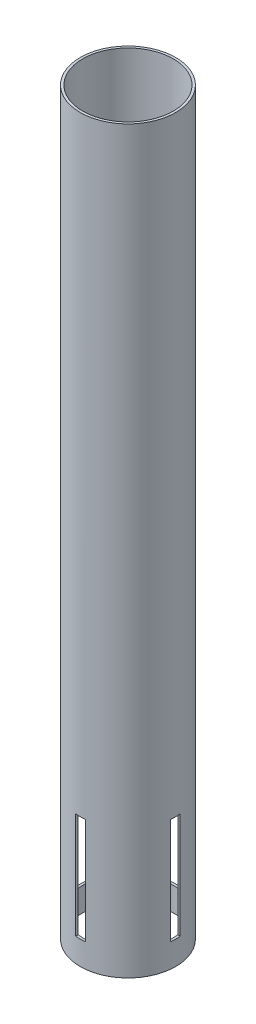
ISO-10303-21;
HEADER;
FILE_DESCRIPTION(('STEP AP214'),'2;1');
FILE_NAME('part.step','',(''),(''),'','','');
FILE_SCHEMA(('AUTOMOTIVE_DESIGN { 1 0 10303 214 1 1 1 1 }'));
ENDSEC;
DATA;
#1=APPLICATION_CONTEXT('core data for automotive mechanical design processes');
#2=APPLICATION_PROTOCOL_DEFINITION('international standard','automotive_design',2000,#1);
#3=PRODUCT_CONTEXT('',#1,'mechanical');
#4=PRODUCT('Part','Part','',(#3));
#5=PRODUCT_RELATED_PRODUCT_CATEGORY('part','',(#4));
#6=PRODUCT_DEFINITION_FORMATION('','',#4);
#7=PRODUCT_DEFINITION_CONTEXT('part definition',#1,'design');
#8=PRODUCT_DEFINITION('design','',#6,#7);
#9=PRODUCT_DEFINITION_SHAPE('','',#8);
#10=(LENGTH_UNIT() NAMED_UNIT(*) SI_UNIT(.MILLI.,.METRE.));
#11=(NAMED_UNIT(*) PLANE_ANGLE_UNIT() SI_UNIT($,.RADIAN.));
#12=(NAMED_UNIT(*) SI_UNIT($,.STERADIAN.) SOLID_ANGLE_UNIT());
#13=UNCERTAINTY_MEASURE_WITH_UNIT(LENGTH_MEASURE(1.E-05),#10,'distance_accuracy_value','');
#14=(GEOMETRIC_REPRESENTATION_CONTEXT(3) GLOBAL_UNCERTAINTY_ASSIGNED_CONTEXT((#13)) GLOBAL_UNIT_ASSIGNED_CONTEXT((#10,
#11,#12)) REPRESENTATION_CONTEXT('',''));
#15=CARTESIAN_POINT('',(0.,0.,0.));
#16=DIRECTION('',(0.,0.,1.));
#17=DIRECTION('',(1.,0.,0.));
#18=AXIS2_PLACEMENT_3D('',#15,#16,#17);
#19=CARTESIAN_POINT('',(0.,787.4,0.));
#20=DIRECTION('',(0.,1.,0.));
#21=DIRECTION('',(0.,0.,1.));
#22=AXIS2_PLACEMENT_3D('',#19,#20,#21);
#23=PLANE('',#22);
#24=CARTESIAN_POINT('',(0.,787.4,0.));
#25=DIRECTION('',(0.,1.,0.));
#26=DIRECTION('',(0.,0.,1.));
#27=AXIS2_PLACEMENT_3D('',#24,#25,#26);
#28=CIRCLE('',#27,50.8);
#29=CARTESIAN_POINT('',(0.,787.4,50.8));
#30=VERTEX_POINT('',#29);
#31=EDGE_CURVE('E296',#30,#30,#28,.T.);
#32=ORIENTED_EDGE('',*,*,#31,.T.);
#33=EDGE_LOOP('',(#32));
#34=FACE_BOUND('',#33,.T.);
#35=CARTESIAN_POINT('',(0.,787.4,0.));
#36=DIRECTION('',(0.,1.,0.));
#37=DIRECTION('',(0.,0.,1.));
#38=AXIS2_PLACEMENT_3D('',#35,#36,#37);
#39=CIRCLE('',#38,48.26);
#40=CARTESIAN_POINT('',(0.,787.4,48.26));
#41=VERTEX_POINT('',#40);
#42=EDGE_CURVE('E288',#41,#41,#39,.T.);
#43=ORIENTED_EDGE('',*,*,#42,.F.);
#44=EDGE_LOOP('',(#43));
#45=FACE_BOUND('',#44,.T.);
#46=ADVANCED_FACE('F38',(#34,#45),#23,.T.);
#47=CARTESIAN_POINT('',(0.,0.,0.));
#48=DIRECTION('',(0.,1.,0.));
#49=DIRECTION('',(0.,0.,1.));
#50=AXIS2_PLACEMENT_3D('',#47,#48,#49);
#51=PLANE('',#50);
#52=CARTESIAN_POINT('',(0.,0.,0.));
#53=DIRECTION('',(0.,1.,0.));
#54=DIRECTION('',(0.,0.,1.));
#55=AXIS2_PLACEMENT_3D('',#52,#53,#54);
#56=CIRCLE('',#55,50.8);
#57=CARTESIAN_POINT('',(0.,0.,50.8));
#58=VERTEX_POINT('',#57);
#59=EDGE_CURVE('E292',#58,#58,#56,.T.);
#60=ORIENTED_EDGE('',*,*,#59,.F.);
#61=EDGE_LOOP('',(#60));
#62=FACE_BOUND('',#61,.T.);
#63=CARTESIAN_POINT('',(0.,0.,0.));
#64=DIRECTION('',(0.,1.,0.));
#65=DIRECTION('',(0.,0.,1.));
#66=AXIS2_PLACEMENT_3D('',#63,#64,#65);
#67=CIRCLE('',#66,48.26);
#68=CARTESIAN_POINT('',(0.,0.,48.26));
#69=VERTEX_POINT('',#68);
#70=EDGE_CURVE('E287',#69,#69,#67,.T.);
#71=ORIENTED_EDGE('',*,*,#70,.T.);
#72=EDGE_LOOP('',(#71));
#73=FACE_BOUND('',#72,.T.);
#74=ADVANCED_FACE('F356',(#62,#73),#51,.F.);
#75=CARTESIAN_POINT('',(0.,787.4,0.));
#76=DIRECTION('',(0.,-1.,0.));
#77=DIRECTION('',(0.,0.,-1.));
#78=AXIS2_PLACEMENT_3D('',#75,#76,#77);
#79=CYLINDRICAL_SURFACE('',#78,50.8);
#80=DIRECTION('',(0.,-1.,0.));
#81=VECTOR('',#80,1.);
#82=CARTESIAN_POINT('',(-50.5453618050163,787.4,5.07999999999989));
#83=LINE('',#82,#81);
#84=CARTESIAN_POINT('',(-50.5453618050163,138.176,5.07999999999997));
#85=VERTEX_POINT('',#84);
#86=CARTESIAN_POINT('',(-50.5453618050163,25.4,5.07999999999999));
#87=VERTEX_POINT('',#86);
#88=EDGE_CURVE('E240',#85,#87,#83,.T.);
#89=ORIENTED_EDGE('',*,*,#88,.T.);
#90=CARTESIAN_POINT('',(0.,25.4,0.));
#91=DIRECTION('',(0.,-1.,0.));
#92=DIRECTION('',(0.,0.,-1.));
#93=AXIS2_PLACEMENT_3D('',#90,#91,#92);
#94=CIRCLE('',#93,50.8);
#95=CARTESIAN_POINT('',(-50.5453618050163,25.4,-5.07999999999999));
#96=VERTEX_POINT('',#95);
#97=EDGE_CURVE('E54',#87,#96,#94,.T.);
#98=ORIENTED_EDGE('',*,*,#97,.T.);
#99=DIRECTION('',(0.,-1.,0.));
#100=VECTOR('',#99,1.);
#101=CARTESIAN_POINT('',(-50.5453618050163,787.4,-5.08000000000028));
#102=LINE('',#101,#100);
#103=CARTESIAN_POINT('',(-50.5453618050163,138.176,-5.08000000000003));
#104=VERTEX_POINT('',#103);
#105=EDGE_CURVE('E172',#96,#104,#102,.F.);
#106=ORIENTED_EDGE('',*,*,#105,.T.);
#107=CARTESIAN_POINT('',(0.,138.176,0.));
#108=DIRECTION('',(0.,1.,0.));
#109=DIRECTION('',(0.,0.,1.));
#110=AXIS2_PLACEMENT_3D('',#107,#108,#109);
#111=CIRCLE('',#110,50.8);
#112=EDGE_CURVE('E234',#104,#85,#111,.T.);
#113=ORIENTED_EDGE('',*,*,#112,.T.);
#114=EDGE_LOOP('',(#89,#98,#106,#113));
#115=FACE_BOUND('',#114,.T.);
#116=DIRECTION('',(0.,-1.,0.));
#117=VECTOR('',#116,1.);
#118=CARTESIAN_POINT('',(50.5453618050163,787.4,-5.08000000000028));
#119=LINE('',#118,#117);
#120=CARTESIAN_POINT('',(50.5453618050163,138.176,-5.08000000000003));
#121=VERTEX_POINT('',#120);
#122=CARTESIAN_POINT('',(50.5453618050163,25.4,-5.07999999999999));
#123=VERTEX_POINT('',#122);
#124=EDGE_CURVE('E220',#121,#123,#119,.T.);
#125=ORIENTED_EDGE('',*,*,#124,.T.);
#126=CARTESIAN_POINT('',(50.5453618050163,25.4,5.07999999999999));
#127=VERTEX_POINT('',#126);
#128=EDGE_CURVE('E62',#123,#127,#94,.T.);
#129=ORIENTED_EDGE('',*,*,#128,.T.);
#130=DIRECTION('',(0.,-1.,0.));
#131=VECTOR('',#130,1.);
#132=CARTESIAN_POINT('',(50.5453618050163,787.4,5.07999999999989));
#133=LINE('',#132,#131);
#134=CARTESIAN_POINT('',(50.5453618050163,138.176,5.07999999999997));
#135=VERTEX_POINT('',#134);
#136=EDGE_CURVE('E210',#127,#135,#133,.F.);
#137=ORIENTED_EDGE('',*,*,#136,.T.);
#138=EDGE_CURVE('E235',#135,#121,#111,.T.);
#139=ORIENTED_EDGE('',*,*,#138,.T.);
#140=EDGE_LOOP('',(#125,#129,#137,#139));
#141=FACE_BOUND('',#140,.T.);
#142=DIRECTION('',(0.,-1.,0.));
#143=VECTOR('',#142,1.);
#144=CARTESIAN_POINT('',(5.08000000000003,787.4,-50.5453618050163));
#145=LINE('',#144,#143);
#146=CARTESIAN_POINT('',(5.08,25.4,-50.5453618050163));
#147=VERTEX_POINT('',#146);
#148=CARTESIAN_POINT('',(5.08,138.176,-50.5453618050163));
#149=VERTEX_POINT('',#148);
#150=EDGE_CURVE('E267',#147,#149,#145,.F.);
#151=ORIENTED_EDGE('',*,*,#150,.T.);
#152=CARTESIAN_POINT('',(0.,138.176,0.));
#153=DIRECTION('',(0.,1.,0.));
#154=DIRECTION('',(0.,0.,1.));
#155=AXIS2_PLACEMENT_3D('',#152,#153,#154);
#156=CIRCLE('',#155,50.8);
#157=CARTESIAN_POINT('',(-5.08,138.176,-50.5453618050163));
#158=VERTEX_POINT('',#157);
#159=EDGE_CURVE('E278',#149,#158,#156,.T.);
#160=ORIENTED_EDGE('',*,*,#159,.T.);
#161=DIRECTION('',(0.,-1.,0.));
#162=VECTOR('',#161,1.);
#163=CARTESIAN_POINT('',(-5.08,787.4,-50.5453618050163));
#164=LINE('',#163,#162);
#165=CARTESIAN_POINT('',(-5.08,25.4,-50.5453618050163));
#166=VERTEX_POINT('',#165);
#167=EDGE_CURVE('E283',#158,#166,#164,.T.);
#168=ORIENTED_EDGE('',*,*,#167,.T.);
#169=CARTESIAN_POINT('',(0.,25.4,0.));
#170=DIRECTION('',(0.,-1.,0.));
#171=DIRECTION('',(0.,0.,-1.));
#172=AXIS2_PLACEMENT_3D('',#169,#170,#171);
#173=CIRCLE('',#172,50.8);
#174=EDGE_CURVE('E263',#166,#147,#173,.T.);
#175=ORIENTED_EDGE('',*,*,#174,.T.);
#176=EDGE_LOOP('',(#151,#160,#168,#175));
#177=FACE_BOUND('',#176,.T.);
#178=CARTESIAN_POINT('',(-5.08,138.176,50.5453618050163));
#179=VERTEX_POINT('',#178);
#180=CARTESIAN_POINT('',(5.08,138.176,50.5453618050163));
#181=VERTEX_POINT('',#180);
#182=EDGE_CURVE('E275',#179,#181,#156,.T.);
#183=ORIENTED_EDGE('',*,*,#182,.T.);
#184=DIRECTION('',(0.,-1.,0.));
#185=VECTOR('',#184,1.);
#186=CARTESIAN_POINT('',(5.08000000000003,787.4,50.5453618050163));
#187=LINE('',#186,#185);
#188=CARTESIAN_POINT('',(5.08,25.4,50.5453618050163));
#189=VERTEX_POINT('',#188);
#190=EDGE_CURVE('E271',#181,#189,#187,.T.);
#191=ORIENTED_EDGE('',*,*,#190,.T.);
#192=CARTESIAN_POINT('',(-5.08,25.4,50.5453618050163));
#193=VERTEX_POINT('',#192);
#194=EDGE_CURVE('E266',#189,#193,#173,.T.);
#195=ORIENTED_EDGE('',*,*,#194,.T.);
#196=DIRECTION('',(0.,-1.,0.));
#197=VECTOR('',#196,1.);
#198=CARTESIAN_POINT('',(-5.08,787.4,50.5453618050163));
#199=LINE('',#198,#197);
#200=EDGE_CURVE('E279',#193,#179,#199,.F.);
#201=ORIENTED_EDGE('',*,*,#200,.T.);
#202=EDGE_LOOP('',(#183,#191,#195,#201));
#203=FACE_BOUND('',#202,.T.);
#204=ORIENTED_EDGE('',*,*,#31,.F.);
#205=EDGE_LOOP('',(#204));
#206=FACE_BOUND('',#205,.T.);
#207=ORIENTED_EDGE('',*,*,#59,.T.);
#208=EDGE_LOOP('',(#207));
#209=FACE_BOUND('',#208,.T.);
#210=ADVANCED_FACE('F40',(#115,#141,#177,#203,#206,#209),#79,.T.);
#211=CARTESIAN_POINT('',(0.,787.4,0.));
#212=DIRECTION('',(0.,-1.,0.));
#213=DIRECTION('',(0.,0.,-1.));
#214=AXIS2_PLACEMENT_3D('',#211,#212,#213);
#215=CYLINDRICAL_SURFACE('',#214,48.26);
#216=DIRECTION('',(0.,-1.,0.));
#217=VECTOR('',#216,1.);
#218=CARTESIAN_POINT('',(47.9918868143356,787.4,5.07999999999989));
#219=LINE('',#218,#217);
#220=CARTESIAN_POINT('',(47.9918868143356,25.4,5.07999999999999));
#221=VERTEX_POINT('',#220);
#222=CARTESIAN_POINT('',(47.9918868143356,138.176,5.07999999999997));
#223=VERTEX_POINT('',#222);
#224=EDGE_CURVE('E11',#221,#223,#219,.F.);
#225=ORIENTED_EDGE('',*,*,#224,.F.);
#226=CARTESIAN_POINT('',(0.,25.4,0.));
#227=DIRECTION('',(0.,-1.,0.));
#228=DIRECTION('',(0.,0.,-1.));
#229=AXIS2_PLACEMENT_3D('',#226,#227,#228);
#230=CIRCLE('',#229,48.26);
#231=CARTESIAN_POINT('',(47.9918868143356,25.4,-5.07999999999999));
#232=VERTEX_POINT('',#231);
#233=EDGE_CURVE('E167',#232,#221,#230,.T.);
#234=ORIENTED_EDGE('',*,*,#233,.F.);
#235=DIRECTION('',(0.,-1.,0.));
#236=VECTOR('',#235,1.);
#237=CARTESIAN_POINT('',(47.9918868143356,787.4,-5.08000000000028));
#238=LINE('',#237,#236);
#239=CARTESIAN_POINT('',(47.9918868143356,138.176,-5.08000000000003));
#240=VERTEX_POINT('',#239);
#241=EDGE_CURVE('E189',#240,#232,#238,.T.);
#242=ORIENTED_EDGE('',*,*,#241,.F.);
#243=CARTESIAN_POINT('',(0.,138.176,0.));
#244=DIRECTION('',(0.,1.,0.));
#245=DIRECTION('',(0.,0.,1.));
#246=AXIS2_PLACEMENT_3D('',#243,#244,#245);
#247=CIRCLE('',#246,48.26);
#248=EDGE_CURVE('E47',#223,#240,#247,.T.);
#249=ORIENTED_EDGE('',*,*,#248,.F.);
#250=EDGE_LOOP('',(#225,#234,#242,#249));
#251=FACE_BOUND('',#250,.T.);
#252=DIRECTION('',(0.,-1.,0.));
#253=VECTOR('',#252,1.);
#254=CARTESIAN_POINT('',(-47.9918868143356,787.4,5.07999999999989));
#255=LINE('',#254,#253);
#256=CARTESIAN_POINT('',(-47.9918868143356,138.176,5.07999999999997));
#257=VERTEX_POINT('',#256);
#258=CARTESIAN_POINT('',(-47.9918868143356,25.4,5.07999999999999));
#259=VERTEX_POINT('',#258);
#260=EDGE_CURVE('E184',#257,#259,#255,.T.);
#261=ORIENTED_EDGE('',*,*,#260,.F.);
#262=CARTESIAN_POINT('',(-47.9918868143356,138.176,-5.08000000000003));
#263=VERTEX_POINT('',#262);
#264=EDGE_CURVE('E180',#263,#257,#247,.T.);
#265=ORIENTED_EDGE('',*,*,#264,.F.);
#266=DIRECTION('',(0.,-1.,0.));
#267=VECTOR('',#266,1.);
#268=CARTESIAN_POINT('',(-47.9918868143356,787.4,-5.08000000000028));
#269=LINE('',#268,#267);
#270=CARTESIAN_POINT('',(-47.9918868143356,25.4,-5.07999999999999));
#271=VERTEX_POINT('',#270);
#272=EDGE_CURVE('E164',#271,#263,#269,.F.);
#273=ORIENTED_EDGE('',*,*,#272,.F.);
#274=EDGE_CURVE('E152',#259,#271,#230,.T.);
#275=ORIENTED_EDGE('',*,*,#274,.F.);
#276=EDGE_LOOP('',(#261,#265,#273,#275));
#277=FACE_BOUND('',#276,.T.);
#278=DIRECTION('',(0.,-1.,0.));
#279=VECTOR('',#278,1.);
#280=CARTESIAN_POINT('',(-5.08,787.4,47.9918868143356));
#281=LINE('',#280,#279);
#282=CARTESIAN_POINT('',(-5.08,25.4,47.9918868143356));
#283=VERTEX_POINT('',#282);
#284=CARTESIAN_POINT('',(-5.08,138.176,47.9918868143356));
#285=VERTEX_POINT('',#284);
#286=EDGE_CURVE('E165',#283,#285,#281,.F.);
#287=ORIENTED_EDGE('',*,*,#286,.F.);
#288=CARTESIAN_POINT('',(0.,25.4,0.));
#289=DIRECTION('',(0.,-1.,0.));
#290=DIRECTION('',(0.,0.,-1.));
#291=AXIS2_PLACEMENT_3D('',#288,#289,#290);
#292=CIRCLE('',#291,48.26);
#293=CARTESIAN_POINT('',(5.08,25.4,47.9918868143356));
#294=VERTEX_POINT('',#293);
#295=EDGE_CURVE('E307',#294,#283,#292,.T.);
#296=ORIENTED_EDGE('',*,*,#295,.F.);
#297=DIRECTION('',(0.,-1.,0.));
#298=VECTOR('',#297,1.);
#299=CARTESIAN_POINT('',(5.08000000000003,787.4,47.9918868143356));
#300=LINE('',#299,#298);
#301=CARTESIAN_POINT('',(5.08,138.176,47.9918868143356));
#302=VERTEX_POINT('',#301);
#303=EDGE_CURVE('E318',#302,#294,#300,.T.);
#304=ORIENTED_EDGE('',*,*,#303,.F.);
#305=CARTESIAN_POINT('',(0.,138.176,0.));
#306=DIRECTION('',(0.,1.,0.));
#307=DIRECTION('',(0.,0.,1.));
#308=AXIS2_PLACEMENT_3D('',#305,#306,#307);
#309=CIRCLE('',#308,48.26);
#310=EDGE_CURVE('E314',#285,#302,#309,.T.);
#311=ORIENTED_EDGE('',*,*,#310,.F.);
#312=EDGE_LOOP('',(#287,#296,#304,#311));
#313=FACE_BOUND('',#312,.T.);
#314=DIRECTION('',(0.,-1.,0.));
#315=VECTOR('',#314,1.);
#316=CARTESIAN_POINT('',(-5.08,787.4,-47.9918868143356));
#317=LINE('',#316,#315);
#318=CARTESIAN_POINT('',(-5.08,138.176,-47.9918868143356));
#319=VERTEX_POINT('',#318);
#320=CARTESIAN_POINT('',(-5.08,25.4,-47.9918868143356));
#321=VERTEX_POINT('',#320);
#322=EDGE_CURVE('E313',#319,#321,#317,.T.);
#323=ORIENTED_EDGE('',*,*,#322,.F.);
#324=CARTESIAN_POINT('',(5.08,138.176,-47.9918868143356));
#325=VERTEX_POINT('',#324);
#326=EDGE_CURVE('E310',#325,#319,#309,.T.);
#327=ORIENTED_EDGE('',*,*,#326,.F.);
#328=DIRECTION('',(0.,-1.,0.));
#329=VECTOR('',#328,1.);
#330=CARTESIAN_POINT('',(5.08000000000003,787.4,-47.9918868143356));
#331=LINE('',#330,#329);
#332=CARTESIAN_POINT('',(5.08,25.4,-47.9918868143356));
#333=VERTEX_POINT('',#332);
#334=EDGE_CURVE('E306',#333,#325,#331,.F.);
#335=ORIENTED_EDGE('',*,*,#334,.F.);
#336=EDGE_CURVE('E300',#321,#333,#292,.T.);
#337=ORIENTED_EDGE('',*,*,#336,.F.);
#338=EDGE_LOOP('',(#323,#327,#335,#337));
#339=FACE_BOUND('',#338,.T.);
#340=ORIENTED_EDGE('',*,*,#42,.T.);
#341=EDGE_LOOP('',(#340));
#342=FACE_BOUND('',#341,.T.);
#343=ORIENTED_EDGE('',*,*,#70,.F.);
#344=EDGE_LOOP('',(#343));
#345=FACE_BOUND('',#344,.T.);
#346=ADVANCED_FACE('F178',(#251,#277,#313,#339,#342,#345),#215,.F.);
#347=CARTESIAN_POINT('',(-5.08,25.4,-50.8));
#348=DIRECTION('',(0.,-1.,0.));
#349=DIRECTION('',(0.,0.,-1.));
#350=AXIS2_PLACEMENT_3D('',#347,#348,#349);
#351=PLANE('',#350);
#352=ORIENTED_EDGE('',*,*,#174,.F.);
#353=DIRECTION('',(0.,0.,1.));
#354=VECTOR('',#353,1.);
#355=CARTESIAN_POINT('',(-5.08,25.4,-50.8));
#356=LINE('',#355,#354);
#357=EDGE_CURVE('E259',#166,#321,#356,.T.);
#358=ORIENTED_EDGE('',*,*,#357,.T.);
#359=ORIENTED_EDGE('',*,*,#336,.T.);
#360=DIRECTION('',(0.,0.,1.));
#361=VECTOR('',#360,1.);
#362=CARTESIAN_POINT('',(5.08,25.4,-50.8));
#363=LINE('',#362,#361);
#364=EDGE_CURVE('E254',#147,#333,#363,.T.);
#365=ORIENTED_EDGE('',*,*,#364,.F.);
#366=EDGE_LOOP('',(#352,#358,#359,#365));
#367=FACE_BOUND('',#366,.T.);
#368=ADVANCED_FACE('F369',(#367),#351,.F.);
#369=CARTESIAN_POINT('',(5.08,25.4,-50.8));
#370=DIRECTION('',(1.,0.,0.));
#371=DIRECTION('',(0.,1.,0.));
#372=AXIS2_PLACEMENT_3D('',#369,#370,#371);
#373=PLANE('',#372);
#374=ORIENTED_EDGE('',*,*,#364,.T.);
#375=ORIENTED_EDGE('',*,*,#334,.T.);
#376=DIRECTION('',(0.,0.,1.));
#377=VECTOR('',#376,1.);
#378=CARTESIAN_POINT('',(5.08,138.176,-50.8));
#379=LINE('',#378,#377);
#380=EDGE_CURVE('E249',#149,#325,#379,.T.);
#381=ORIENTED_EDGE('',*,*,#380,.F.);
#382=ORIENTED_EDGE('',*,*,#150,.F.);
#383=EDGE_LOOP('',(#374,#375,#381,#382));
#384=FACE_BOUND('',#383,.T.);
#385=ADVANCED_FACE('F375',(#384),#373,.F.);
#386=CARTESIAN_POINT('',(-5.08,138.176,-50.8));
#387=DIRECTION('',(0.,1.,0.));
#388=DIRECTION('',(0.,0.,1.));
#389=AXIS2_PLACEMENT_3D('',#386,#387,#388);
#390=PLANE('',#389);
#391=ORIENTED_EDGE('',*,*,#380,.T.);
#392=ORIENTED_EDGE('',*,*,#326,.T.);
#393=DIRECTION('',(0.,0.,1.));
#394=VECTOR('',#393,1.);
#395=CARTESIAN_POINT('',(-5.08,138.176,-50.8));
#396=LINE('',#395,#394);
#397=EDGE_CURVE('E248',#158,#319,#396,.T.);
#398=ORIENTED_EDGE('',*,*,#397,.F.);
#399=ORIENTED_EDGE('',*,*,#159,.F.);
#400=EDGE_LOOP('',(#391,#392,#398,#399));
#401=FACE_BOUND('',#400,.T.);
#402=ADVANCED_FACE('F413',(#401),#390,.F.);
#403=CARTESIAN_POINT('',(-5.08,25.4,-50.8));
#404=DIRECTION('',(-1.,0.,0.));
#405=DIRECTION('',(0.,0.,1.));
#406=AXIS2_PLACEMENT_3D('',#403,#404,#405);
#407=PLANE('',#406);
#408=ORIENTED_EDGE('',*,*,#397,.T.);
#409=ORIENTED_EDGE('',*,*,#322,.T.);
#410=ORIENTED_EDGE('',*,*,#357,.F.);
#411=ORIENTED_EDGE('',*,*,#167,.F.);
#412=EDGE_LOOP('',(#408,#409,#410,#411));
#413=FACE_BOUND('',#412,.T.);
#414=ADVANCED_FACE('F421',(#413),#407,.F.);
#415=EDGE_CURVE('E243',#283,#193,#356,.T.);
#416=ORIENTED_EDGE('',*,*,#415,.F.);
#417=ORIENTED_EDGE('',*,*,#286,.T.);
#418=EDGE_CURVE('E244',#285,#179,#396,.T.);
#419=ORIENTED_EDGE('',*,*,#418,.T.);
#420=ORIENTED_EDGE('',*,*,#200,.F.);
#421=EDGE_LOOP('',(#416,#417,#419,#420));
#422=FACE_BOUND('',#421,.T.);
#423=ADVANCED_FACE('F429',(#422),#407,.F.);
#424=ORIENTED_EDGE('',*,*,#182,.F.);
#425=ORIENTED_EDGE('',*,*,#418,.F.);
#426=ORIENTED_EDGE('',*,*,#310,.T.);
#427=EDGE_CURVE('E250',#302,#181,#379,.T.);
#428=ORIENTED_EDGE('',*,*,#427,.T.);
#429=EDGE_LOOP('',(#424,#425,#426,#428));
#430=FACE_BOUND('',#429,.T.);
#431=ADVANCED_FACE('F330',(#430),#390,.F.);
#432=ORIENTED_EDGE('',*,*,#427,.F.);
#433=ORIENTED_EDGE('',*,*,#303,.T.);
#434=EDGE_CURVE('E255',#294,#189,#363,.T.);
#435=ORIENTED_EDGE('',*,*,#434,.T.);
#436=ORIENTED_EDGE('',*,*,#190,.F.);
#437=EDGE_LOOP('',(#432,#433,#435,#436));
#438=FACE_BOUND('',#437,.T.);
#439=ADVANCED_FACE('F334',(#438),#373,.F.);
#440=ORIENTED_EDGE('',*,*,#434,.F.);
#441=ORIENTED_EDGE('',*,*,#295,.T.);
#442=ORIENTED_EDGE('',*,*,#415,.T.);
#443=ORIENTED_EDGE('',*,*,#194,.F.);
#444=EDGE_LOOP('',(#440,#441,#442,#443));
#445=FACE_BOUND('',#444,.T.);
#446=ADVANCED_FACE('F378',(#445),#351,.F.);
#447=CARTESIAN_POINT('',(-50.8,25.4,5.07999999999999));
#448=DIRECTION('',(0.,-1.,0.));
#449=DIRECTION('',(0.,0.,-1.));
#450=AXIS2_PLACEMENT_3D('',#447,#448,#449);
#451=PLANE('',#450);
#452=DIRECTION('',(1.,0.,0.));
#453=VECTOR('',#452,1.);
#454=CARTESIAN_POINT('',(-50.8,25.4,5.07999999999999));
#455=LINE('',#454,#453);
#456=EDGE_CURVE('E158',#87,#259,#455,.T.);
#457=ORIENTED_EDGE('',*,*,#456,.T.);
#458=ORIENTED_EDGE('',*,*,#274,.T.);
#459=DIRECTION('',(1.,0.,0.));
#460=VECTOR('',#459,1.);
#461=CARTESIAN_POINT('',(-50.8,25.4,-5.07999999999999));
#462=LINE('',#461,#460);
#463=EDGE_CURVE('E155',#96,#271,#462,.T.);
#464=ORIENTED_EDGE('',*,*,#463,.F.);
#465=ORIENTED_EDGE('',*,*,#97,.F.);
#466=EDGE_LOOP('',(#457,#458,#464,#465));
#467=FACE_BOUND('',#466,.T.);
#468=ADVANCED_FACE('F154',(#467),#451,.F.);
#469=CARTESIAN_POINT('',(-50.8,138.176,-5.08000000000003));
#470=DIRECTION('',(0.,0.,-1.));
#471=DIRECTION('',(0.,1.,0.));
#472=AXIS2_PLACEMENT_3D('',#469,#470,#471);
#473=PLANE('',#472);
#474=ORIENTED_EDGE('',*,*,#463,.T.);
#475=ORIENTED_EDGE('',*,*,#272,.T.);
#476=DIRECTION('',(1.,0.,0.));
#477=VECTOR('',#476,1.);
#478=CARTESIAN_POINT('',(-50.8,138.176,-5.08000000000003));
#479=LINE('',#478,#477);
#480=EDGE_CURVE('E222',#104,#263,#479,.T.);
#481=ORIENTED_EDGE('',*,*,#480,.F.);
#482=ORIENTED_EDGE('',*,*,#105,.F.);
#483=EDGE_LOOP('',(#474,#475,#481,#482));
#484=FACE_BOUND('',#483,.T.);
#485=ADVANCED_FACE('F169',(#484),#473,.F.);
#486=CARTESIAN_POINT('',(-50.8,138.176,5.07999999999997));
#487=DIRECTION('',(0.,1.,0.));
#488=DIRECTION('',(0.,0.,1.));
#489=AXIS2_PLACEMENT_3D('',#486,#487,#488);
#490=PLANE('',#489);
#491=ORIENTED_EDGE('',*,*,#480,.T.);
#492=ORIENTED_EDGE('',*,*,#264,.T.);
#493=DIRECTION('',(1.,0.,0.));
#494=VECTOR('',#493,1.);
#495=CARTESIAN_POINT('',(-50.8,138.176,5.07999999999997));
#496=LINE('',#495,#494);
#497=EDGE_CURVE('E351',#85,#257,#496,.T.);
#498=ORIENTED_EDGE('',*,*,#497,.F.);
#499=ORIENTED_EDGE('',*,*,#112,.F.);
#500=EDGE_LOOP('',(#491,#492,#498,#499));
#501=FACE_BOUND('',#500,.T.);
#502=ADVANCED_FACE('F460',(#501),#490,.F.);
#503=CARTESIAN_POINT('',(-50.8,138.176,5.07999999999997));
#504=DIRECTION('',(0.,0.,1.));
#505=DIRECTION('',(0.,-1.,0.));
#506=AXIS2_PLACEMENT_3D('',#503,#504,#505);
#507=PLANE('',#506);
#508=ORIENTED_EDGE('',*,*,#497,.T.);
#509=ORIENTED_EDGE('',*,*,#260,.T.);
#510=ORIENTED_EDGE('',*,*,#456,.F.);
#511=ORIENTED_EDGE('',*,*,#88,.F.);
#512=EDGE_LOOP('',(#508,#509,#510,#511));
#513=FACE_BOUND('',#512,.T.);
#514=ADVANCED_FACE('F467',(#513),#507,.F.);
#515=EDGE_CURVE('E202',#221,#127,#455,.T.);
#516=ORIENTED_EDGE('',*,*,#515,.F.);
#517=ORIENTED_EDGE('',*,*,#224,.T.);
#518=EDGE_CURVE('E217',#223,#135,#496,.T.);
#519=ORIENTED_EDGE('',*,*,#518,.T.);
#520=ORIENTED_EDGE('',*,*,#136,.F.);
#521=EDGE_LOOP('',(#516,#517,#519,#520));
#522=FACE_BOUND('',#521,.T.);
#523=ADVANCED_FACE('F207',(#522),#507,.F.);
#524=ORIENTED_EDGE('',*,*,#518,.F.);
#525=ORIENTED_EDGE('',*,*,#248,.T.);
#526=EDGE_CURVE('E174',#240,#121,#479,.T.);
#527=ORIENTED_EDGE('',*,*,#526,.T.);
#528=ORIENTED_EDGE('',*,*,#138,.F.);
#529=EDGE_LOOP('',(#524,#525,#527,#528));
#530=FACE_BOUND('',#529,.T.);
#531=ADVANCED_FACE('F216',(#530),#490,.F.);
#532=ORIENTED_EDGE('',*,*,#526,.F.);
#533=ORIENTED_EDGE('',*,*,#241,.T.);
#534=EDGE_CURVE('E175',#232,#123,#462,.T.);
#535=ORIENTED_EDGE('',*,*,#534,.T.);
#536=ORIENTED_EDGE('',*,*,#124,.F.);
#537=EDGE_LOOP('',(#532,#533,#535,#536));
#538=FACE_BOUND('',#537,.T.);
#539=ADVANCED_FACE('F219',(#538),#473,.F.);
#540=ORIENTED_EDGE('',*,*,#534,.F.);
#541=ORIENTED_EDGE('',*,*,#233,.T.);
#542=ORIENTED_EDGE('',*,*,#515,.T.);
#543=ORIENTED_EDGE('',*,*,#128,.F.);
#544=EDGE_LOOP('',(#540,#541,#542,#543));
#545=FACE_BOUND('',#544,.T.);
#546=ADVANCED_FACE('F201',(#545),#451,.F.);
#547=CLOSED_SHELL('',(#46,#74,#210,#346,#368,#385,#402,#414,#423,#431,#439,#446,#468,#485,#502,
#514,#523,#531,#539,#546));
#548=MANIFOLD_SOLID_BREP('B2',#547);
#549=ADVANCED_BREP_SHAPE_REPRESENTATION('',(#18,#548),#14);
#550=SHAPE_DEFINITION_REPRESENTATION(#9,#549);
ENDSEC;
END-ISO-10303-21;
